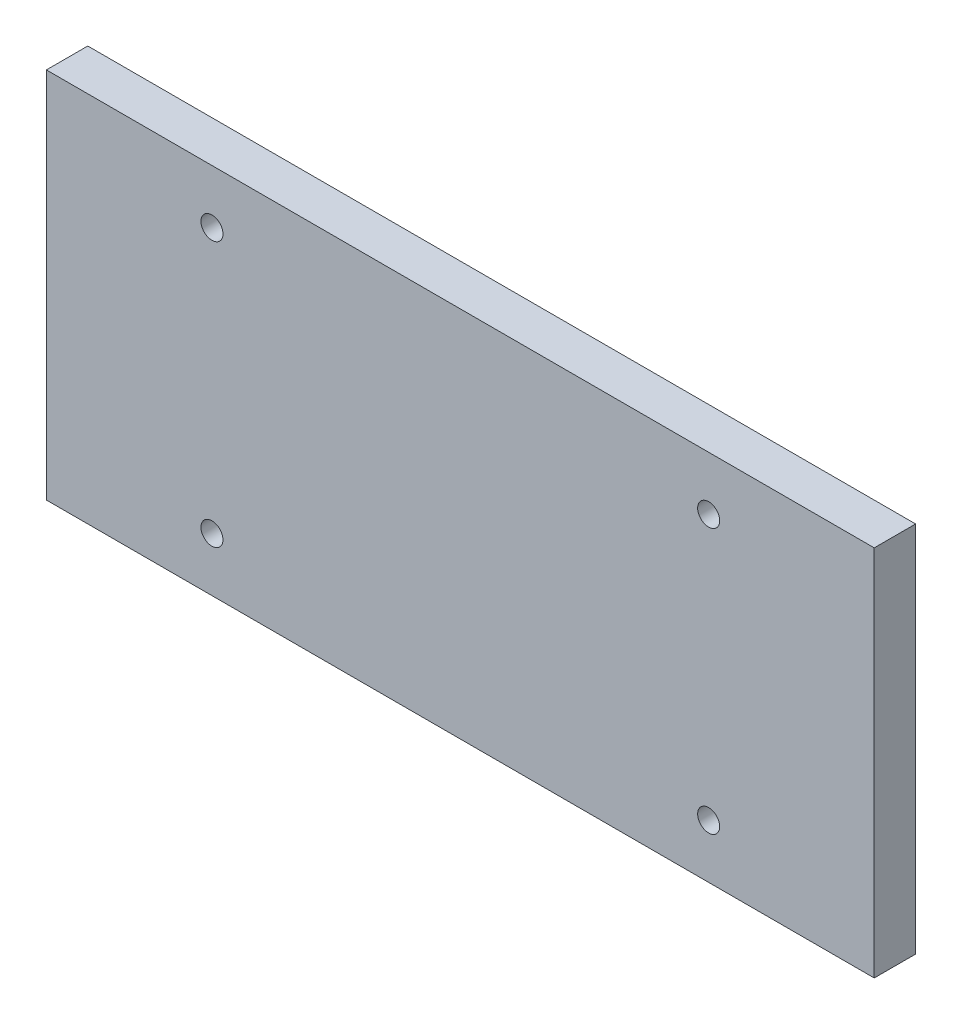
ISO-10303-21;
HEADER;
FILE_DESCRIPTION(('STEP AP214'),'2;1');
FILE_NAME('part.step','',(''),(''),'','','');
FILE_SCHEMA(('AUTOMOTIVE_DESIGN { 1 0 10303 214 1 1 1 1 }'));
ENDSEC;
DATA;
#1=APPLICATION_CONTEXT('core data for automotive mechanical design processes');
#2=APPLICATION_PROTOCOL_DEFINITION('international standard','automotive_design',2000,#1);
#3=PRODUCT_CONTEXT('',#1,'mechanical');
#4=PRODUCT('Part','Part','',(#3));
#5=PRODUCT_RELATED_PRODUCT_CATEGORY('part','',(#4));
#6=PRODUCT_DEFINITION_FORMATION('','',#4);
#7=PRODUCT_DEFINITION_CONTEXT('part definition',#1,'design');
#8=PRODUCT_DEFINITION('design','',#6,#7);
#9=PRODUCT_DEFINITION_SHAPE('','',#8);
#10=(LENGTH_UNIT() NAMED_UNIT(*) SI_UNIT(.MILLI.,.METRE.));
#11=(NAMED_UNIT(*) PLANE_ANGLE_UNIT() SI_UNIT($,.RADIAN.));
#12=(NAMED_UNIT(*) SI_UNIT($,.STERADIAN.) SOLID_ANGLE_UNIT());
#13=UNCERTAINTY_MEASURE_WITH_UNIT(LENGTH_MEASURE(1.E-05),#10,'distance_accuracy_value','');
#14=(GEOMETRIC_REPRESENTATION_CONTEXT(3) GLOBAL_UNCERTAINTY_ASSIGNED_CONTEXT((#13)) GLOBAL_UNIT_ASSIGNED_CONTEXT((#10,
#11,#12)) REPRESENTATION_CONTEXT('',''));
#15=CARTESIAN_POINT('',(0.,0.,0.));
#16=DIRECTION('',(0.,0.,1.));
#17=DIRECTION('',(1.,0.,0.));
#18=AXIS2_PLACEMENT_3D('',#15,#16,#17);
#19=CARTESIAN_POINT('',(127.,-57.15,12.7));
#20=DIRECTION('',(-1.,0.,0.));
#21=DIRECTION('',(0.,0.,1.));
#22=AXIS2_PLACEMENT_3D('',#19,#20,#21);
#23=PLANE('',#22);
#24=DIRECTION('',(0.,1.,0.));
#25=VECTOR('',#24,1.);
#26=CARTESIAN_POINT('',(127.,-57.15,0.));
#27=LINE('',#26,#25);
#28=CARTESIAN_POINT('',(127.,-57.15,0.));
#29=VERTEX_POINT('',#28);
#30=CARTESIAN_POINT('',(127.,57.15,0.));
#31=VERTEX_POINT('',#30);
#32=EDGE_CURVE('E106',#29,#31,#27,.T.);
#33=ORIENTED_EDGE('',*,*,#32,.T.);
#34=DIRECTION('',(0.,0.,-1.));
#35=VECTOR('',#34,1.);
#36=CARTESIAN_POINT('',(127.,57.15,12.7));
#37=LINE('',#36,#35);
#38=CARTESIAN_POINT('',(127.,57.15,12.7));
#39=VERTEX_POINT('',#38);
#40=EDGE_CURVE('E11',#39,#31,#37,.T.);
#41=ORIENTED_EDGE('',*,*,#40,.F.);
#42=DIRECTION('',(0.,1.,0.));
#43=VECTOR('',#42,1.);
#44=CARTESIAN_POINT('',(127.,-57.15,12.7));
#45=LINE('',#44,#43);
#46=CARTESIAN_POINT('',(127.,-57.15,12.7));
#47=VERTEX_POINT('',#46);
#48=EDGE_CURVE('E94',#47,#39,#45,.T.);
#49=ORIENTED_EDGE('',*,*,#48,.F.);
#50=DIRECTION('',(0.,0.,-1.));
#51=VECTOR('',#50,1.);
#52=CARTESIAN_POINT('',(127.,-57.15,12.7));
#53=LINE('',#52,#51);
#54=EDGE_CURVE('E102',#47,#29,#53,.T.);
#55=ORIENTED_EDGE('',*,*,#54,.T.);
#56=EDGE_LOOP('',(#33,#41,#49,#55));
#57=FACE_BOUND('',#56,.T.);
#58=ADVANCED_FACE('F42',(#57),#23,.F.);
#59=CARTESIAN_POINT('',(-127.,57.15,12.7));
#60=DIRECTION('',(0.,-1.,0.));
#61=DIRECTION('',(0.,0.,-1.));
#62=AXIS2_PLACEMENT_3D('',#59,#60,#61);
#63=PLANE('',#62);
#64=DIRECTION('',(-1.,0.,0.));
#65=VECTOR('',#64,1.);
#66=CARTESIAN_POINT('',(-127.,57.15,0.));
#67=LINE('',#66,#65);
#68=CARTESIAN_POINT('',(-127.,57.15,0.));
#69=VERTEX_POINT('',#68);
#70=EDGE_CURVE('E98',#31,#69,#67,.T.);
#71=ORIENTED_EDGE('',*,*,#70,.T.);
#72=DIRECTION('',(0.,0.,-1.));
#73=VECTOR('',#72,1.);
#74=CARTESIAN_POINT('',(-127.,57.15,12.7));
#75=LINE('',#74,#73);
#76=CARTESIAN_POINT('',(-127.,57.15,12.7));
#77=VERTEX_POINT('',#76);
#78=EDGE_CURVE('E50',#77,#69,#75,.T.);
#79=ORIENTED_EDGE('',*,*,#78,.F.);
#80=DIRECTION('',(-1.,0.,0.));
#81=VECTOR('',#80,1.);
#82=CARTESIAN_POINT('',(-127.,57.15,12.7));
#83=LINE('',#82,#81);
#84=EDGE_CURVE('E88',#39,#77,#83,.T.);
#85=ORIENTED_EDGE('',*,*,#84,.F.);
#86=ORIENTED_EDGE('',*,*,#40,.T.);
#87=EDGE_LOOP('',(#71,#79,#85,#86));
#88=FACE_BOUND('',#87,.T.);
#89=ADVANCED_FACE('F97',(#88),#63,.F.);
#90=CARTESIAN_POINT('',(-127.,-57.15,12.7));
#91=DIRECTION('',(1.,0.,0.));
#92=DIRECTION('',(0.,0.,-1.));
#93=AXIS2_PLACEMENT_3D('',#90,#91,#92);
#94=PLANE('',#93);
#95=DIRECTION('',(0.,-1.,0.));
#96=VECTOR('',#95,1.);
#97=CARTESIAN_POINT('',(-127.,-57.15,0.));
#98=LINE('',#97,#96);
#99=CARTESIAN_POINT('',(-127.,-57.15,0.));
#100=VERTEX_POINT('',#99);
#101=EDGE_CURVE('E75',#69,#100,#98,.T.);
#102=ORIENTED_EDGE('',*,*,#101,.T.);
#103=DIRECTION('',(0.,0.,-1.));
#104=VECTOR('',#103,1.);
#105=CARTESIAN_POINT('',(-127.,-57.15,12.7));
#106=LINE('',#105,#104);
#107=CARTESIAN_POINT('',(-127.,-57.15,12.7));
#108=VERTEX_POINT('',#107);
#109=EDGE_CURVE('E99',#108,#100,#106,.T.);
#110=ORIENTED_EDGE('',*,*,#109,.F.);
#111=DIRECTION('',(0.,-1.,0.));
#112=VECTOR('',#111,1.);
#113=CARTESIAN_POINT('',(-127.,-57.15,12.7));
#114=LINE('',#113,#112);
#115=EDGE_CURVE('E92',#77,#108,#114,.T.);
#116=ORIENTED_EDGE('',*,*,#115,.F.);
#117=ORIENTED_EDGE('',*,*,#78,.T.);
#118=EDGE_LOOP('',(#102,#110,#116,#117));
#119=FACE_BOUND('',#118,.T.);
#120=ADVANCED_FACE('F100',(#119),#94,.F.);
#121=CARTESIAN_POINT('',(-127.,-57.15,12.7));
#122=DIRECTION('',(0.,1.,0.));
#123=DIRECTION('',(0.,0.,1.));
#124=AXIS2_PLACEMENT_3D('',#121,#122,#123);
#125=PLANE('',#124);
#126=DIRECTION('',(1.,0.,0.));
#127=VECTOR('',#126,1.);
#128=CARTESIAN_POINT('',(-127.,-57.15,0.));
#129=LINE('',#128,#127);
#130=EDGE_CURVE('E81',#100,#29,#129,.T.);
#131=ORIENTED_EDGE('',*,*,#130,.T.);
#132=ORIENTED_EDGE('',*,*,#54,.F.);
#133=DIRECTION('',(1.,0.,0.));
#134=VECTOR('',#133,1.);
#135=CARTESIAN_POINT('',(-127.,-57.15,12.7));
#136=LINE('',#135,#134);
#137=EDGE_CURVE('E58',#108,#47,#136,.T.);
#138=ORIENTED_EDGE('',*,*,#137,.F.);
#139=ORIENTED_EDGE('',*,*,#109,.T.);
#140=EDGE_LOOP('',(#131,#132,#138,#139));
#141=FACE_BOUND('',#140,.T.);
#142=ADVANCED_FACE('F114',(#141),#125,.F.);
#143=CARTESIAN_POINT('',(0.,0.,12.7));
#144=DIRECTION('',(0.,0.,-1.));
#145=DIRECTION('',(-1.,0.,0.));
#146=AXIS2_PLACEMENT_3D('',#143,#144,#145);
#147=PLANE('',#146);
#148=ORIENTED_EDGE('',*,*,#84,.T.);
#149=ORIENTED_EDGE('',*,*,#115,.T.);
#150=ORIENTED_EDGE('',*,*,#137,.T.);
#151=ORIENTED_EDGE('',*,*,#48,.T.);
#152=EDGE_LOOP('',(#148,#149,#150,#151));
#153=FACE_BOUND('',#152,.T.);
#154=CARTESIAN_POINT('',(76.2,40.64,12.7));
#155=DIRECTION('',(0.,0.,-1.));
#156=DIRECTION('',(-1.,0.,0.));
#157=AXIS2_PLACEMENT_3D('',#154,#155,#156);
#158=CIRCLE('',#157,3.37819999999998);
#159=CARTESIAN_POINT('',(72.8218,40.64,12.7));
#160=VERTEX_POINT('',#159);
#161=EDGE_CURVE('E130',#160,#160,#158,.F.);
#162=ORIENTED_EDGE('',*,*,#161,.F.);
#163=EDGE_LOOP('',(#162));
#164=FACE_BOUND('',#163,.T.);
#165=CARTESIAN_POINT('',(76.2,-40.64,12.7));
#166=DIRECTION('',(0.,0.,-1.));
#167=DIRECTION('',(-1.,0.,0.));
#168=AXIS2_PLACEMENT_3D('',#165,#166,#167);
#169=CIRCLE('',#168,3.37819999999998);
#170=CARTESIAN_POINT('',(72.8218,-40.64,12.7));
#171=VERTEX_POINT('',#170);
#172=EDGE_CURVE('E129',#171,#171,#169,.F.);
#173=ORIENTED_EDGE('',*,*,#172,.F.);
#174=EDGE_LOOP('',(#173));
#175=FACE_BOUND('',#174,.T.);
#176=CARTESIAN_POINT('',(-76.1999999999999,-40.64,12.7));
#177=DIRECTION('',(0.,0.,-1.));
#178=DIRECTION('',(-1.,0.,0.));
#179=AXIS2_PLACEMENT_3D('',#176,#177,#178);
#180=CIRCLE('',#179,3.37819999999999);
#181=CARTESIAN_POINT('',(-79.5782,-40.64,12.7));
#182=VERTEX_POINT('',#181);
#183=EDGE_CURVE('E136',#182,#182,#180,.F.);
#184=ORIENTED_EDGE('',*,*,#183,.F.);
#185=EDGE_LOOP('',(#184));
#186=FACE_BOUND('',#185,.T.);
#187=CARTESIAN_POINT('',(-76.2,40.64,12.7));
#188=DIRECTION('',(0.,0.,-1.));
#189=DIRECTION('',(-1.,0.,0.));
#190=AXIS2_PLACEMENT_3D('',#187,#188,#189);
#191=CIRCLE('',#190,3.37819999999999);
#192=CARTESIAN_POINT('',(-79.5782,40.64,12.7));
#193=VERTEX_POINT('',#192);
#194=EDGE_CURVE('E109',#193,#193,#191,.F.);
#195=ORIENTED_EDGE('',*,*,#194,.F.);
#196=EDGE_LOOP('',(#195));
#197=FACE_BOUND('',#196,.T.);
#198=ADVANCED_FACE('F89',(#153,#164,#175,#186,#197),#147,.F.);
#199=CARTESIAN_POINT('',(0.,0.,0.));
#200=DIRECTION('',(0.,0.,-1.));
#201=DIRECTION('',(-1.,0.,0.));
#202=AXIS2_PLACEMENT_3D('',#199,#200,#201);
#203=PLANE('',#202);
#204=CARTESIAN_POINT('',(76.2,40.64,0.));
#205=DIRECTION('',(0.,0.,-1.));
#206=DIRECTION('',(-1.,0.,0.));
#207=AXIS2_PLACEMENT_3D('',#204,#205,#206);
#208=CIRCLE('',#207,3.37819999999998);
#209=CARTESIAN_POINT('',(72.8218,40.64,0.));
#210=VERTEX_POINT('',#209);
#211=EDGE_CURVE('E126',#210,#210,#208,.T.);
#212=ORIENTED_EDGE('',*,*,#211,.F.);
#213=EDGE_LOOP('',(#212));
#214=FACE_BOUND('',#213,.T.);
#215=CARTESIAN_POINT('',(76.2,-40.64,0.));
#216=DIRECTION('',(0.,0.,-1.));
#217=DIRECTION('',(-1.,0.,0.));
#218=AXIS2_PLACEMENT_3D('',#215,#216,#217);
#219=CIRCLE('',#218,3.37819999999998);
#220=CARTESIAN_POINT('',(72.8218,-40.64,0.));
#221=VERTEX_POINT('',#220);
#222=EDGE_CURVE('E133',#221,#221,#219,.T.);
#223=ORIENTED_EDGE('',*,*,#222,.F.);
#224=EDGE_LOOP('',(#223));
#225=FACE_BOUND('',#224,.T.);
#226=CARTESIAN_POINT('',(-76.1999999999999,-40.64,0.));
#227=DIRECTION('',(0.,0.,-1.));
#228=DIRECTION('',(-1.,0.,0.));
#229=AXIS2_PLACEMENT_3D('',#226,#227,#228);
#230=CIRCLE('',#229,3.37819999999999);
#231=CARTESIAN_POINT('',(-79.5782,-40.64,0.));
#232=VERTEX_POINT('',#231);
#233=EDGE_CURVE('E125',#232,#232,#230,.T.);
#234=ORIENTED_EDGE('',*,*,#233,.F.);
#235=EDGE_LOOP('',(#234));
#236=FACE_BOUND('',#235,.T.);
#237=CARTESIAN_POINT('',(-76.2,40.64,0.));
#238=DIRECTION('',(0.,0.,-1.));
#239=DIRECTION('',(-1.,0.,0.));
#240=AXIS2_PLACEMENT_3D('',#237,#238,#239);
#241=CIRCLE('',#240,3.37819999999999);
#242=CARTESIAN_POINT('',(-79.5782,40.64,0.));
#243=VERTEX_POINT('',#242);
#244=EDGE_CURVE('E122',#243,#243,#241,.T.);
#245=ORIENTED_EDGE('',*,*,#244,.F.);
#246=EDGE_LOOP('',(#245));
#247=FACE_BOUND('',#246,.T.);
#248=ORIENTED_EDGE('',*,*,#32,.F.);
#249=ORIENTED_EDGE('',*,*,#130,.F.);
#250=ORIENTED_EDGE('',*,*,#101,.F.);
#251=ORIENTED_EDGE('',*,*,#70,.F.);
#252=EDGE_LOOP('',(#248,#249,#250,#251));
#253=FACE_BOUND('',#252,.T.);
#254=ADVANCED_FACE('F117',(#214,#225,#236,#247,#253),#203,.T.);
#255=CARTESIAN_POINT('',(-76.2,40.64,22.2549925128176));
#256=DIRECTION('',(0.,0.,-1.));
#257=DIRECTION('',(-1.,0.,0.));
#258=AXIS2_PLACEMENT_3D('',#255,#256,#257);
#259=CYLINDRICAL_SURFACE('',#258,3.37819999999999);
#260=ORIENTED_EDGE('',*,*,#194,.T.);
#261=EDGE_LOOP('',(#260));
#262=FACE_BOUND('',#261,.T.);
#263=ORIENTED_EDGE('',*,*,#244,.T.);
#264=EDGE_LOOP('',(#263));
#265=FACE_BOUND('',#264,.T.);
#266=ADVANCED_FACE('F152',(#262,#265),#259,.F.);
#267=CARTESIAN_POINT('',(-76.1999999999999,-40.64,22.2549925128176));
#268=DIRECTION('',(0.,0.,-1.));
#269=DIRECTION('',(-1.,0.,0.));
#270=AXIS2_PLACEMENT_3D('',#267,#268,#269);
#271=CYLINDRICAL_SURFACE('',#270,3.37819999999999);
#272=ORIENTED_EDGE('',*,*,#183,.T.);
#273=EDGE_LOOP('',(#272));
#274=FACE_BOUND('',#273,.T.);
#275=ORIENTED_EDGE('',*,*,#233,.T.);
#276=EDGE_LOOP('',(#275));
#277=FACE_BOUND('',#276,.T.);
#278=ADVANCED_FACE('F144',(#274,#277),#271,.F.);
#279=CARTESIAN_POINT('',(76.2,-40.64,22.2549925128176));
#280=DIRECTION('',(0.,0.,-1.));
#281=DIRECTION('',(-1.,0.,0.));
#282=AXIS2_PLACEMENT_3D('',#279,#280,#281);
#283=CYLINDRICAL_SURFACE('',#282,3.37819999999998);
#284=ORIENTED_EDGE('',*,*,#172,.T.);
#285=EDGE_LOOP('',(#284));
#286=FACE_BOUND('',#285,.T.);
#287=ORIENTED_EDGE('',*,*,#222,.T.);
#288=EDGE_LOOP('',(#287));
#289=FACE_BOUND('',#288,.T.);
#290=ADVANCED_FACE('F200',(#286,#289),#283,.F.);
#291=CARTESIAN_POINT('',(76.2,40.64,22.2549925128176));
#292=DIRECTION('',(0.,0.,-1.));
#293=DIRECTION('',(-1.,0.,0.));
#294=AXIS2_PLACEMENT_3D('',#291,#292,#293);
#295=CYLINDRICAL_SURFACE('',#294,3.37819999999998);
#296=ORIENTED_EDGE('',*,*,#161,.T.);
#297=EDGE_LOOP('',(#296));
#298=FACE_BOUND('',#297,.T.);
#299=ORIENTED_EDGE('',*,*,#211,.T.);
#300=EDGE_LOOP('',(#299));
#301=FACE_BOUND('',#300,.T.);
#302=ADVANCED_FACE('F207',(#298,#301),#295,.F.);
#303=CLOSED_SHELL('',(#58,#89,#120,#142,#198,#254,#266,#278,#290,#302));
#304=MANIFOLD_SOLID_BREP('B2',#303);
#305=ADVANCED_BREP_SHAPE_REPRESENTATION('',(#18,#304),#14);
#306=SHAPE_DEFINITION_REPRESENTATION(#9,#305);
ENDSEC;
END-ISO-10303-21;
